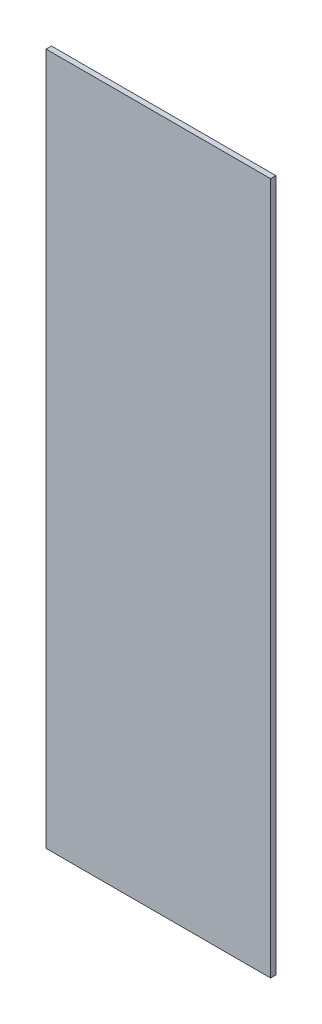
ISO-10303-21;
HEADER;
FILE_DESCRIPTION(('STEP AP214'),'2;1');
FILE_NAME('part.step','',(''),(''),'','','');
FILE_SCHEMA(('AUTOMOTIVE_DESIGN { 1 0 10303 214 1 1 1 1 }'));
ENDSEC;
DATA;
#1=APPLICATION_CONTEXT('core data for automotive mechanical design processes');
#2=APPLICATION_PROTOCOL_DEFINITION('international standard','automotive_design',2000,#1);
#3=PRODUCT_CONTEXT('',#1,'mechanical');
#4=PRODUCT('Part','Part','',(#3));
#5=PRODUCT_RELATED_PRODUCT_CATEGORY('part','',(#4));
#6=PRODUCT_DEFINITION_FORMATION('','',#4);
#7=PRODUCT_DEFINITION_CONTEXT('part definition',#1,'design');
#8=PRODUCT_DEFINITION('design','',#6,#7);
#9=PRODUCT_DEFINITION_SHAPE('','',#8);
#10=(LENGTH_UNIT() NAMED_UNIT(*) SI_UNIT(.MILLI.,.METRE.));
#11=(NAMED_UNIT(*) PLANE_ANGLE_UNIT() SI_UNIT($,.RADIAN.));
#12=(NAMED_UNIT(*) SI_UNIT($,.STERADIAN.) SOLID_ANGLE_UNIT());
#13=UNCERTAINTY_MEASURE_WITH_UNIT(LENGTH_MEASURE(1.E-05),#10,'distance_accuracy_value','');
#14=(GEOMETRIC_REPRESENTATION_CONTEXT(3) GLOBAL_UNCERTAINTY_ASSIGNED_CONTEXT((#13)) GLOBAL_UNIT_ASSIGNED_CONTEXT((#10,
#11,#12)) REPRESENTATION_CONTEXT('',''));
#15=CARTESIAN_POINT('',(0.,0.,0.));
#16=DIRECTION('',(0.,0.,1.));
#17=DIRECTION('',(1.,0.,0.));
#18=AXIS2_PLACEMENT_3D('',#15,#16,#17);
#19=CARTESIAN_POINT('',(267.500000051,-825.,12.7));
#20=DIRECTION('',(-1.,0.,0.));
#21=DIRECTION('',(0.,0.,1.));
#22=AXIS2_PLACEMENT_3D('',#19,#20,#21);
#23=PLANE('',#22);
#24=DIRECTION('',(0.,1.,0.));
#25=VECTOR('',#24,1.);
#26=CARTESIAN_POINT('',(267.500000051,-825.,0.));
#27=LINE('',#26,#25);
#28=CARTESIAN_POINT('',(267.500000051,-825.,0.));
#29=VERTEX_POINT('',#28);
#30=CARTESIAN_POINT('',(267.500000051,825.,0.));
#31=VERTEX_POINT('',#30);
#32=EDGE_CURVE('E107',#29,#31,#27,.T.);
#33=ORIENTED_EDGE('',*,*,#32,.T.);
#34=DIRECTION('',(0.,0.,-1.));
#35=VECTOR('',#34,1.);
#36=CARTESIAN_POINT('',(267.500000051,825.,12.7));
#37=LINE('',#36,#35);
#38=CARTESIAN_POINT('',(267.500000051,825.,12.7));
#39=VERTEX_POINT('',#38);
#40=EDGE_CURVE('E11',#39,#31,#37,.T.);
#41=ORIENTED_EDGE('',*,*,#40,.F.);
#42=DIRECTION('',(0.,1.,0.));
#43=VECTOR('',#42,1.);
#44=CARTESIAN_POINT('',(267.500000051,-825.,12.7));
#45=LINE('',#44,#43);
#46=CARTESIAN_POINT('',(267.500000051,-825.,12.7));
#47=VERTEX_POINT('',#46);
#48=EDGE_CURVE('E91',#47,#39,#45,.T.);
#49=ORIENTED_EDGE('',*,*,#48,.F.);
#50=DIRECTION('',(0.,0.,-1.));
#51=VECTOR('',#50,1.);
#52=CARTESIAN_POINT('',(267.500000051,-825.,12.7));
#53=LINE('',#52,#51);
#54=EDGE_CURVE('E103',#47,#29,#53,.T.);
#55=ORIENTED_EDGE('',*,*,#54,.T.);
#56=EDGE_LOOP('',(#33,#41,#49,#55));
#57=FACE_BOUND('',#56,.T.);
#58=ADVANCED_FACE('F39',(#57),#23,.F.);
#59=CARTESIAN_POINT('',(-267.500000051,825.,12.7));
#60=DIRECTION('',(0.,-1.,0.));
#61=DIRECTION('',(0.,0.,-1.));
#62=AXIS2_PLACEMENT_3D('',#59,#60,#61);
#63=PLANE('',#62);
#64=DIRECTION('',(-1.,0.,0.));
#65=VECTOR('',#64,1.);
#66=CARTESIAN_POINT('',(-267.500000051,825.,0.));
#67=LINE('',#66,#65);
#68=CARTESIAN_POINT('',(-267.500000051,825.,0.));
#69=VERTEX_POINT('',#68);
#70=EDGE_CURVE('E96',#31,#69,#67,.T.);
#71=ORIENTED_EDGE('',*,*,#70,.T.);
#72=DIRECTION('',(0.,0.,-1.));
#73=VECTOR('',#72,1.);
#74=CARTESIAN_POINT('',(-267.500000051,825.,12.7));
#75=LINE('',#74,#73);
#76=CARTESIAN_POINT('',(-267.500000051,825.,12.7));
#77=VERTEX_POINT('',#76);
#78=EDGE_CURVE('E48',#77,#69,#75,.T.);
#79=ORIENTED_EDGE('',*,*,#78,.F.);
#80=DIRECTION('',(-1.,0.,0.));
#81=VECTOR('',#80,1.);
#82=CARTESIAN_POINT('',(-267.500000051,825.,12.7));
#83=LINE('',#82,#81);
#84=EDGE_CURVE('E86',#39,#77,#83,.T.);
#85=ORIENTED_EDGE('',*,*,#84,.F.);
#86=ORIENTED_EDGE('',*,*,#40,.T.);
#87=EDGE_LOOP('',(#71,#79,#85,#86));
#88=FACE_BOUND('',#87,.T.);
#89=ADVANCED_FACE('F95',(#88),#63,.F.);
#90=CARTESIAN_POINT('',(-267.500000051,-825.,12.7));
#91=DIRECTION('',(1.,0.,0.));
#92=DIRECTION('',(0.,0.,-1.));
#93=AXIS2_PLACEMENT_3D('',#90,#91,#92);
#94=PLANE('',#93);
#95=DIRECTION('',(0.,-1.,0.));
#96=VECTOR('',#95,1.);
#97=CARTESIAN_POINT('',(-267.500000051,-825.,0.));
#98=LINE('',#97,#96);
#99=CARTESIAN_POINT('',(-267.500000051,-825.,0.));
#100=VERTEX_POINT('',#99);
#101=EDGE_CURVE('E73',#69,#100,#98,.T.);
#102=ORIENTED_EDGE('',*,*,#101,.T.);
#103=DIRECTION('',(0.,0.,-1.));
#104=VECTOR('',#103,1.);
#105=CARTESIAN_POINT('',(-267.500000051,-825.,12.7));
#106=LINE('',#105,#104);
#107=CARTESIAN_POINT('',(-267.500000051,-825.,12.7));
#108=VERTEX_POINT('',#107);
#109=EDGE_CURVE('E98',#108,#100,#106,.T.);
#110=ORIENTED_EDGE('',*,*,#109,.F.);
#111=DIRECTION('',(0.,-1.,0.));
#112=VECTOR('',#111,1.);
#113=CARTESIAN_POINT('',(-267.500000051,-825.,12.7));
#114=LINE('',#113,#112);
#115=EDGE_CURVE('E89',#77,#108,#114,.T.);
#116=ORIENTED_EDGE('',*,*,#115,.F.);
#117=ORIENTED_EDGE('',*,*,#78,.T.);
#118=EDGE_LOOP('',(#102,#110,#116,#117));
#119=FACE_BOUND('',#118,.T.);
#120=ADVANCED_FACE('F99',(#119),#94,.F.);
#121=CARTESIAN_POINT('',(-267.500000051,-825.,12.7));
#122=DIRECTION('',(0.,1.,0.));
#123=DIRECTION('',(0.,0.,1.));
#124=AXIS2_PLACEMENT_3D('',#121,#122,#123);
#125=PLANE('',#124);
#126=DIRECTION('',(1.,0.,0.));
#127=VECTOR('',#126,1.);
#128=CARTESIAN_POINT('',(-267.500000051,-825.,0.));
#129=LINE('',#128,#127);
#130=EDGE_CURVE('E79',#100,#29,#129,.T.);
#131=ORIENTED_EDGE('',*,*,#130,.T.);
#132=ORIENTED_EDGE('',*,*,#54,.F.);
#133=DIRECTION('',(1.,0.,0.));
#134=VECTOR('',#133,1.);
#135=CARTESIAN_POINT('',(-267.500000051,-825.,12.7));
#136=LINE('',#135,#134);
#137=EDGE_CURVE('E56',#108,#47,#136,.T.);
#138=ORIENTED_EDGE('',*,*,#137,.F.);
#139=ORIENTED_EDGE('',*,*,#109,.T.);
#140=EDGE_LOOP('',(#131,#132,#138,#139));
#141=FACE_BOUND('',#140,.T.);
#142=ADVANCED_FACE('F120',(#141),#125,.F.);
#143=CARTESIAN_POINT('',(0.,0.,12.7));
#144=DIRECTION('',(0.,0.,-1.));
#145=DIRECTION('',(-1.,0.,0.));
#146=AXIS2_PLACEMENT_3D('',#143,#144,#145);
#147=PLANE('',#146);
#148=ORIENTED_EDGE('',*,*,#48,.T.);
#149=ORIENTED_EDGE('',*,*,#84,.T.);
#150=ORIENTED_EDGE('',*,*,#115,.T.);
#151=ORIENTED_EDGE('',*,*,#137,.T.);
#152=EDGE_LOOP('',(#148,#149,#150,#151));
#153=FACE_BOUND('',#152,.T.);
#154=ADVANCED_FACE('F87',(#153),#147,.F.);
#155=CARTESIAN_POINT('',(0.,0.,0.));
#156=DIRECTION('',(0.,0.,-1.));
#157=DIRECTION('',(-1.,0.,0.));
#158=AXIS2_PLACEMENT_3D('',#155,#156,#157);
#159=PLANE('',#158);
#160=ORIENTED_EDGE('',*,*,#32,.F.);
#161=ORIENTED_EDGE('',*,*,#130,.F.);
#162=ORIENTED_EDGE('',*,*,#101,.F.);
#163=ORIENTED_EDGE('',*,*,#70,.F.);
#164=EDGE_LOOP('',(#160,#161,#162,#163));
#165=FACE_BOUND('',#164,.T.);
#166=ADVANCED_FACE('F123',(#165),#159,.T.);
#167=CLOSED_SHELL('',(#58,#89,#120,#142,#154,#166));
#168=MANIFOLD_SOLID_BREP('B2',#167);
#169=ADVANCED_BREP_SHAPE_REPRESENTATION('',(#18,#168),#14);
#170=SHAPE_DEFINITION_REPRESENTATION(#9,#169);
ENDSEC;
END-ISO-10303-21;
